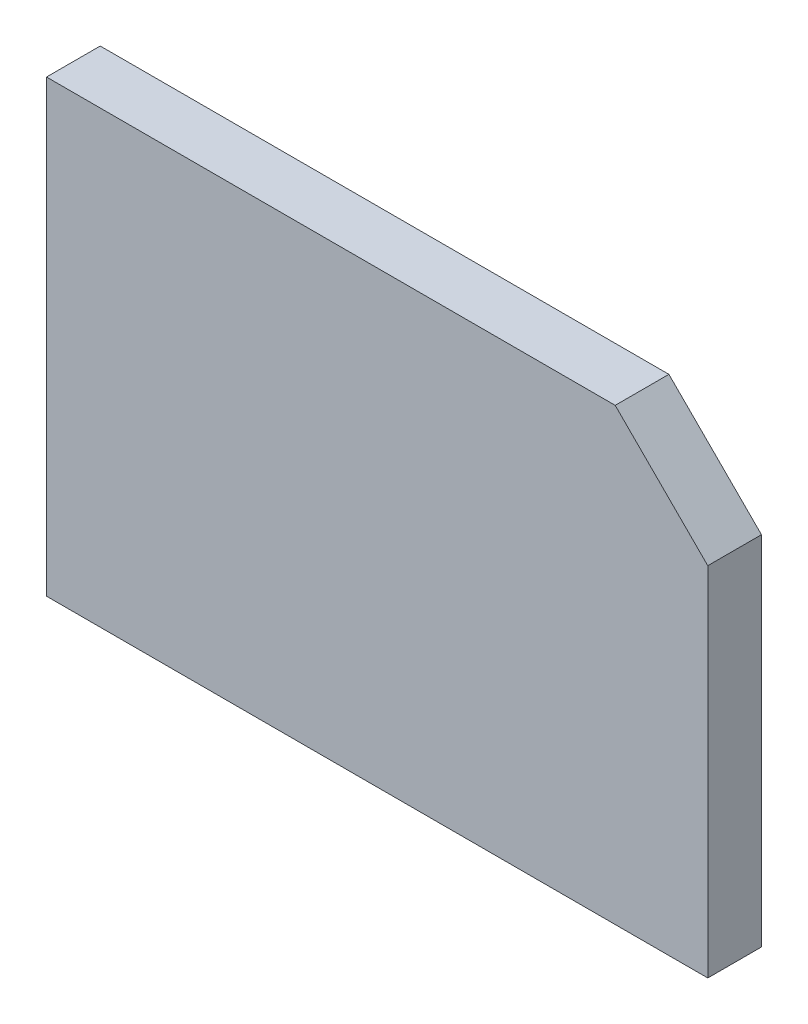
ISO-10303-21;
HEADER;
FILE_DESCRIPTION(('STEP AP214'),'2;1');
FILE_NAME('part.step','',(''),(''),'','','');
FILE_SCHEMA(('AUTOMOTIVE_DESIGN { 1 0 10303 214 1 1 1 1 }'));
ENDSEC;
DATA;
#1=APPLICATION_CONTEXT('core data for automotive mechanical design processes');
#2=APPLICATION_PROTOCOL_DEFINITION('international standard','automotive_design',2000,#1);
#3=PRODUCT_CONTEXT('',#1,'mechanical');
#4=PRODUCT('Part','Part','',(#3));
#5=PRODUCT_RELATED_PRODUCT_CATEGORY('part','',(#4));
#6=PRODUCT_DEFINITION_FORMATION('','',#4);
#7=PRODUCT_DEFINITION_CONTEXT('part definition',#1,'design');
#8=PRODUCT_DEFINITION('design','',#6,#7);
#9=PRODUCT_DEFINITION_SHAPE('','',#8);
#10=(LENGTH_UNIT() NAMED_UNIT(*) SI_UNIT(.MILLI.,.METRE.));
#11=(NAMED_UNIT(*) PLANE_ANGLE_UNIT() SI_UNIT($,.RADIAN.));
#12=(NAMED_UNIT(*) SI_UNIT($,.STERADIAN.) SOLID_ANGLE_UNIT());
#13=UNCERTAINTY_MEASURE_WITH_UNIT(LENGTH_MEASURE(1.E-05),#10,'distance_accuracy_value','');
#14=(GEOMETRIC_REPRESENTATION_CONTEXT(3) GLOBAL_UNCERTAINTY_ASSIGNED_CONTEXT((#13)) GLOBAL_UNIT_ASSIGNED_CONTEXT((#10,
#11,#12)) REPRESENTATION_CONTEXT('',''));
#15=CARTESIAN_POINT('',(0.,0.,0.));
#16=DIRECTION('',(0.,0.,1.));
#17=DIRECTION('',(1.,0.,0.));
#18=AXIS2_PLACEMENT_3D('',#15,#16,#17);
#19=CARTESIAN_POINT('',(1.25,-0.85,0.203));
#20=DIRECTION('',(0.,0.,1.));
#21=DIRECTION('',(1.,0.,0.));
#22=AXIS2_PLACEMENT_3D('',#19,#20,#21);
#23=PLANE('',#22);
#24=DIRECTION('',(0.,1.,0.));
#25=VECTOR('',#24,1.);
#26=CARTESIAN_POINT('',(-1.25,-0.85,0.203));
#27=LINE('',#26,#25);
#28=CARTESIAN_POINT('',(-1.25,-0.85,0.203));
#29=VERTEX_POINT('',#28);
#30=CARTESIAN_POINT('',(-1.25,0.85,0.203));
#31=VERTEX_POINT('',#30);
#32=EDGE_CURVE('E86',#29,#31,#27,.T.);
#33=ORIENTED_EDGE('',*,*,#32,.F.);
#34=DIRECTION('',(1.,0.,0.));
#35=VECTOR('',#34,1.);
#36=CARTESIAN_POINT('',(1.25,-0.85,0.203));
#37=LINE('',#36,#35);
#38=CARTESIAN_POINT('',(1.25,-0.85,0.203));
#39=VERTEX_POINT('',#38);
#40=EDGE_CURVE('E75',#39,#29,#37,.F.);
#41=ORIENTED_EDGE('',*,*,#40,.F.);
#42=DIRECTION('',(0.,1.,0.));
#43=VECTOR('',#42,1.);
#44=CARTESIAN_POINT('',(1.25,-0.85,0.203));
#45=LINE('',#44,#43);
#46=CARTESIAN_POINT('',(1.25,0.500000000000001,0.203));
#47=VERTEX_POINT('',#46);
#48=EDGE_CURVE('E19',#39,#47,#45,.T.);
#49=ORIENTED_EDGE('',*,*,#48,.T.);
#50=DIRECTION('',(-0.707106781186548,0.707106781186548,0.));
#51=VECTOR('',#50,1.);
#52=CARTESIAN_POINT('',(0.9,0.85,0.203));
#53=LINE('',#52,#51);
#54=CARTESIAN_POINT('',(0.9,0.85,0.203));
#55=VERTEX_POINT('',#54);
#56=EDGE_CURVE('E64',#55,#47,#53,.F.);
#57=ORIENTED_EDGE('',*,*,#56,.F.);
#58=DIRECTION('',(1.,0.,0.));
#59=VECTOR('',#58,1.);
#60=CARTESIAN_POINT('',(-1.25,0.85,0.203));
#61=LINE('',#60,#59);
#62=EDGE_CURVE('E59',#31,#55,#61,.T.);
#63=ORIENTED_EDGE('',*,*,#62,.F.);
#64=EDGE_LOOP('',(#33,#41,#49,#57,#63));
#65=FACE_BOUND('',#64,.T.);
#66=ADVANCED_FACE('F16',(#65),#23,.T.);
#67=CARTESIAN_POINT('',(1.25,-0.85,0.));
#68=DIRECTION('',(-1.,0.,0.));
#69=DIRECTION('',(0.,0.,1.));
#70=AXIS2_PLACEMENT_3D('',#67,#68,#69);
#71=PLANE('',#70);
#72=DIRECTION('',(0.,0.,1.));
#73=VECTOR('',#72,1.);
#74=CARTESIAN_POINT('',(1.25,0.5,0.));
#75=LINE('',#74,#73);
#76=CARTESIAN_POINT('',(1.25,0.5,0.));
#77=VERTEX_POINT('',#76);
#78=EDGE_CURVE('E69',#47,#77,#75,.F.);
#79=ORIENTED_EDGE('',*,*,#78,.F.);
#80=ORIENTED_EDGE('',*,*,#48,.F.);
#81=DIRECTION('',(0.,0.,-1.));
#82=VECTOR('',#81,1.);
#83=CARTESIAN_POINT('',(1.25,-0.85,0.));
#84=LINE('',#83,#82);
#85=CARTESIAN_POINT('',(1.25,-0.85,0.));
#86=VERTEX_POINT('',#85);
#87=EDGE_CURVE('E90',#86,#39,#84,.F.);
#88=ORIENTED_EDGE('',*,*,#87,.F.);
#89=DIRECTION('',(0.,1.,0.));
#90=VECTOR('',#89,1.);
#91=CARTESIAN_POINT('',(1.25,-0.85,0.));
#92=LINE('',#91,#90);
#93=EDGE_CURVE('E81',#86,#77,#92,.T.);
#94=ORIENTED_EDGE('',*,*,#93,.T.);
#95=EDGE_LOOP('',(#79,#80,#88,#94));
#96=FACE_BOUND('',#95,.T.);
#97=ADVANCED_FACE('F80',(#96),#71,.F.);
#98=CARTESIAN_POINT('',(0.9,0.85,0.));
#99=DIRECTION('',(0.707106781186548,0.707106781186548,0.));
#100=DIRECTION('',(-0.707106781186548,0.707106781186548,0.));
#101=AXIS2_PLACEMENT_3D('',#98,#99,#100);
#102=PLANE('',#101);
#103=ORIENTED_EDGE('',*,*,#78,.T.);
#104=DIRECTION('',(-0.707106781186547,0.707106781186547,0.));
#105=VECTOR('',#104,1.);
#106=CARTESIAN_POINT('',(1.25,0.5,0.));
#107=LINE('',#106,#105);
#108=CARTESIAN_POINT('',(0.9,0.85,0.));
#109=VERTEX_POINT('',#108);
#110=EDGE_CURVE('E95',#77,#109,#107,.T.);
#111=ORIENTED_EDGE('',*,*,#110,.T.);
#112=DIRECTION('',(0.,0.,1.));
#113=VECTOR('',#112,1.);
#114=CARTESIAN_POINT('',(0.9,0.85,0.));
#115=LINE('',#114,#113);
#116=EDGE_CURVE('E71',#55,#109,#115,.F.);
#117=ORIENTED_EDGE('',*,*,#116,.F.);
#118=ORIENTED_EDGE('',*,*,#56,.T.);
#119=EDGE_LOOP('',(#103,#111,#117,#118));
#120=FACE_BOUND('',#119,.T.);
#121=ADVANCED_FACE('F66',(#120),#102,.T.);
#122=CARTESIAN_POINT('',(-1.25,0.85,0.));
#123=DIRECTION('',(0.,1.,0.));
#124=DIRECTION('',(0.,0.,1.));
#125=AXIS2_PLACEMENT_3D('',#122,#123,#124);
#126=PLANE('',#125);
#127=ORIENTED_EDGE('',*,*,#116,.T.);
#128=DIRECTION('',(1.,0.,0.));
#129=VECTOR('',#128,1.);
#130=CARTESIAN_POINT('',(1.25,0.85,0.));
#131=LINE('',#130,#129);
#132=CARTESIAN_POINT('',(-1.25,0.85,0.));
#133=VERTEX_POINT('',#132);
#134=EDGE_CURVE('E97',#109,#133,#131,.F.);
#135=ORIENTED_EDGE('',*,*,#134,.T.);
#136=DIRECTION('',(0.,0.,1.));
#137=VECTOR('',#136,1.);
#138=CARTESIAN_POINT('',(-1.25,0.85,0.));
#139=LINE('',#138,#137);
#140=EDGE_CURVE('E88',#31,#133,#139,.F.);
#141=ORIENTED_EDGE('',*,*,#140,.F.);
#142=ORIENTED_EDGE('',*,*,#62,.T.);
#143=EDGE_LOOP('',(#127,#135,#141,#142));
#144=FACE_BOUND('',#143,.T.);
#145=ADVANCED_FACE('F107',(#144),#126,.T.);
#146=CARTESIAN_POINT('',(-1.25,-0.85,0.));
#147=DIRECTION('',(-1.,0.,0.));
#148=DIRECTION('',(0.,0.,1.));
#149=AXIS2_PLACEMENT_3D('',#146,#147,#148);
#150=PLANE('',#149);
#151=ORIENTED_EDGE('',*,*,#140,.T.);
#152=DIRECTION('',(0.,1.,0.));
#153=VECTOR('',#152,1.);
#154=CARTESIAN_POINT('',(-1.25,-0.85,0.));
#155=LINE('',#154,#153);
#156=CARTESIAN_POINT('',(-1.25,-0.85,0.));
#157=VERTEX_POINT('',#156);
#158=EDGE_CURVE('E25',#133,#157,#155,.F.);
#159=ORIENTED_EDGE('',*,*,#158,.T.);
#160=DIRECTION('',(0.,0.,-1.));
#161=VECTOR('',#160,1.);
#162=CARTESIAN_POINT('',(-1.25,-0.85,0.));
#163=LINE('',#162,#161);
#164=EDGE_CURVE('E33',#29,#157,#163,.T.);
#165=ORIENTED_EDGE('',*,*,#164,.F.);
#166=ORIENTED_EDGE('',*,*,#32,.T.);
#167=EDGE_LOOP('',(#151,#159,#165,#166));
#168=FACE_BOUND('',#167,.T.);
#169=ADVANCED_FACE('F103',(#168),#150,.T.);
#170=CARTESIAN_POINT('',(1.25,-0.85,0.));
#171=DIRECTION('',(0.,-1.,0.));
#172=DIRECTION('',(0.,0.,-1.));
#173=AXIS2_PLACEMENT_3D('',#170,#171,#172);
#174=PLANE('',#173);
#175=ORIENTED_EDGE('',*,*,#164,.T.);
#176=DIRECTION('',(1.,0.,0.));
#177=VECTOR('',#176,1.);
#178=CARTESIAN_POINT('',(1.25,-0.85,0.));
#179=LINE('',#178,#177);
#180=EDGE_CURVE('E10',#157,#86,#179,.T.);
#181=ORIENTED_EDGE('',*,*,#180,.T.);
#182=ORIENTED_EDGE('',*,*,#87,.T.);
#183=ORIENTED_EDGE('',*,*,#40,.T.);
#184=EDGE_LOOP('',(#175,#181,#182,#183));
#185=FACE_BOUND('',#184,.T.);
#186=ADVANCED_FACE('F115',(#185),#174,.T.);
#187=CARTESIAN_POINT('',(1.25,-0.85,0.));
#188=DIRECTION('',(0.,0.,1.));
#189=DIRECTION('',(1.,0.,0.));
#190=AXIS2_PLACEMENT_3D('',#187,#188,#189);
#191=PLANE('',#190);
#192=ORIENTED_EDGE('',*,*,#158,.F.);
#193=ORIENTED_EDGE('',*,*,#134,.F.);
#194=ORIENTED_EDGE('',*,*,#110,.F.);
#195=ORIENTED_EDGE('',*,*,#93,.F.);
#196=ORIENTED_EDGE('',*,*,#180,.F.);
#197=EDGE_LOOP('',(#192,#193,#194,#195,#196));
#198=FACE_BOUND('',#197,.T.);
#199=ADVANCED_FACE('F106',(#198),#191,.F.);
#200=CLOSED_SHELL('',(#66,#97,#121,#145,#169,#186,#199));
#201=MANIFOLD_SOLID_BREP('B1',#200);
#202=ADVANCED_BREP_SHAPE_REPRESENTATION('',(#18,#201),#14);
#203=SHAPE_DEFINITION_REPRESENTATION(#9,#202);
ENDSEC;
END-ISO-10303-21;
